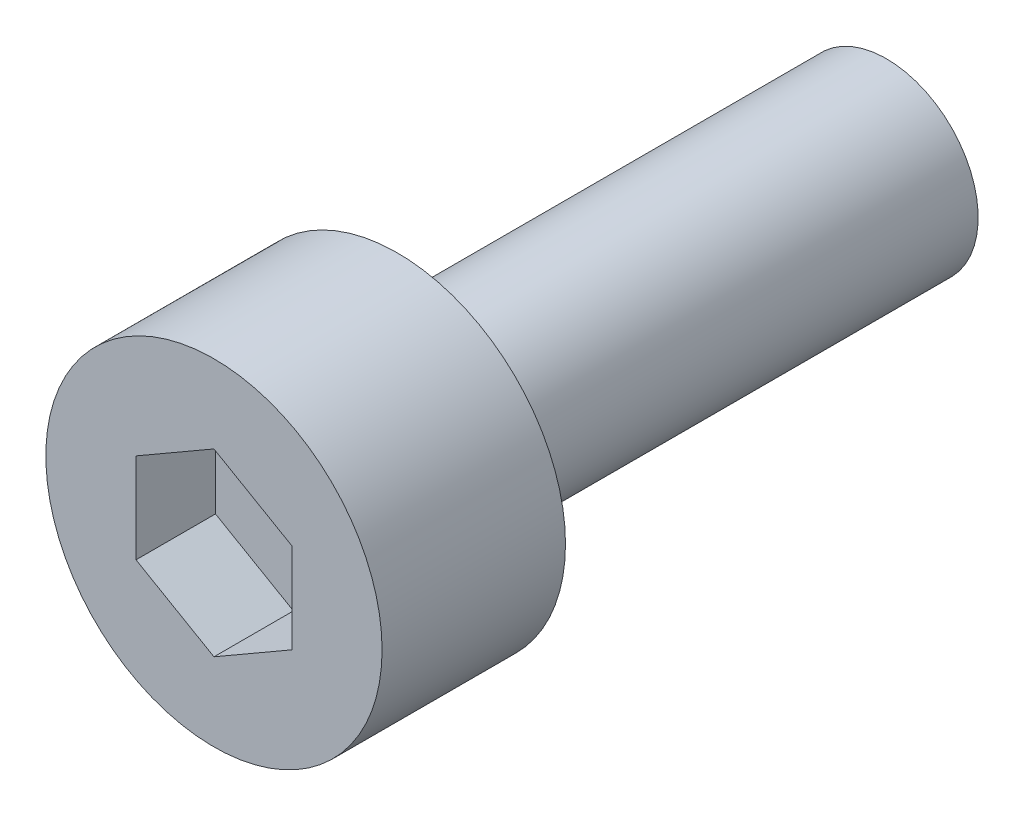
ISO-10303-21;
HEADER;
FILE_DESCRIPTION(('STEP AP214'),'2;1');
FILE_NAME('part.step','',(''),(''),'','','');
FILE_SCHEMA(('AUTOMOTIVE_DESIGN { 1 0 10303 214 1 1 1 1 }'));
ENDSEC;
DATA;
#1=APPLICATION_CONTEXT('core data for automotive mechanical design processes');
#2=APPLICATION_PROTOCOL_DEFINITION('international standard','automotive_design',2000,#1);
#3=PRODUCT_CONTEXT('',#1,'mechanical');
#4=PRODUCT('Part','Part','',(#3));
#5=PRODUCT_RELATED_PRODUCT_CATEGORY('part','',(#4));
#6=PRODUCT_DEFINITION_FORMATION('','',#4);
#7=PRODUCT_DEFINITION_CONTEXT('part definition',#1,'design');
#8=PRODUCT_DEFINITION('design','',#6,#7);
#9=PRODUCT_DEFINITION_SHAPE('','',#8);
#10=(LENGTH_UNIT() NAMED_UNIT(*) SI_UNIT(.MILLI.,.METRE.));
#11=(NAMED_UNIT(*) PLANE_ANGLE_UNIT() SI_UNIT($,.RADIAN.));
#12=(NAMED_UNIT(*) SI_UNIT($,.STERADIAN.) SOLID_ANGLE_UNIT());
#13=UNCERTAINTY_MEASURE_WITH_UNIT(LENGTH_MEASURE(1.E-05),#10,'distance_accuracy_value','');
#14=(GEOMETRIC_REPRESENTATION_CONTEXT(3) GLOBAL_UNCERTAINTY_ASSIGNED_CONTEXT((#13)) GLOBAL_UNIT_ASSIGNED_CONTEXT((#10,
#11,#12)) REPRESENTATION_CONTEXT('',''));
#15=CARTESIAN_POINT('',(0.,0.,0.));
#16=DIRECTION('',(0.,0.,1.));
#17=DIRECTION('',(1.,0.,0.));
#18=AXIS2_PLACEMENT_3D('',#15,#16,#17);
#19=CARTESIAN_POINT('',(0.,0.,3.));
#20=DIRECTION('',(0.,0.,-1.));
#21=DIRECTION('',(-1.,0.,0.));
#22=AXIS2_PLACEMENT_3D('',#19,#20,#21);
#23=CYLINDRICAL_SURFACE('',#22,2.75);
#24=CARTESIAN_POINT('',(0.,0.,3.));
#25=DIRECTION('',(0.,0.,1.));
#26=DIRECTION('',(1.,0.,0.));
#27=AXIS2_PLACEMENT_3D('',#24,#25,#26);
#28=CIRCLE('',#27,2.75);
#29=CARTESIAN_POINT('',(2.75,0.,3.));
#30=VERTEX_POINT('',#29);
#31=EDGE_CURVE('E48',#30,#30,#28,.T.);
#32=ORIENTED_EDGE('',*,*,#31,.F.);
#33=EDGE_LOOP('',(#32));
#34=FACE_BOUND('',#33,.T.);
#35=CARTESIAN_POINT('',(0.,0.,0.));
#36=DIRECTION('',(0.,0.,1.));
#37=DIRECTION('',(1.,0.,0.));
#38=AXIS2_PLACEMENT_3D('',#35,#36,#37);
#39=CIRCLE('',#38,2.75);
#40=CARTESIAN_POINT('',(2.75,0.,0.));
#41=VERTEX_POINT('',#40);
#42=EDGE_CURVE('E43',#41,#41,#39,.T.);
#43=ORIENTED_EDGE('',*,*,#42,.T.);
#44=EDGE_LOOP('',(#43));
#45=FACE_BOUND('',#44,.T.);
#46=ADVANCED_FACE('F40',(#34,#45),#23,.T.);
#47=CARTESIAN_POINT('',(0.,0.,3.));
#48=DIRECTION('',(0.,0.,1.));
#49=DIRECTION('',(1.,0.,0.));
#50=AXIS2_PLACEMENT_3D('',#47,#48,#49);
#51=PLANE('',#50);
#52=DIRECTION('',(0.866025403784439,0.5,0.));
#53=VECTOR('',#52,1.);
#54=CARTESIAN_POINT('',(0.,-1.47224318643355,3.));
#55=LINE('',#54,#53);
#56=CARTESIAN_POINT('',(0.,-1.47224318643355,3.));
#57=VERTEX_POINT('',#56);
#58=CARTESIAN_POINT('',(1.275,-0.736121593216773,3.));
#59=VERTEX_POINT('',#58);
#60=EDGE_CURVE('E56',#57,#59,#55,.T.);
#61=ORIENTED_EDGE('',*,*,#60,.F.);
#62=DIRECTION('',(0.866025403784439,-0.5,0.));
#63=VECTOR('',#62,1.);
#64=CARTESIAN_POINT('',(-1.275,-0.736121593216773,3.));
#65=LINE('',#64,#63);
#66=CARTESIAN_POINT('',(-1.275,-0.736121593216773,3.));
#67=VERTEX_POINT('',#66);
#68=EDGE_CURVE('E140',#67,#57,#65,.T.);
#69=ORIENTED_EDGE('',*,*,#68,.F.);
#70=DIRECTION('',(0.,-1.,0.));
#71=VECTOR('',#70,1.);
#72=CARTESIAN_POINT('',(-1.275,0.736121593216774,3.));
#73=LINE('',#72,#71);
#74=CARTESIAN_POINT('',(-1.275,0.736121593216774,3.));
#75=VERTEX_POINT('',#74);
#76=EDGE_CURVE('E138',#75,#67,#73,.T.);
#77=ORIENTED_EDGE('',*,*,#76,.F.);
#78=DIRECTION('',(-0.866025403784439,-0.5,0.));
#79=VECTOR('',#78,1.);
#80=CARTESIAN_POINT('',(0.,1.47224318643355,3.));
#81=LINE('',#80,#79);
#82=CARTESIAN_POINT('',(0.,1.47224318643355,3.));
#83=VERTEX_POINT('',#82);
#84=EDGE_CURVE('E104',#83,#75,#81,.T.);
#85=ORIENTED_EDGE('',*,*,#84,.F.);
#86=DIRECTION('',(-0.866025403784439,0.5,0.));
#87=VECTOR('',#86,1.);
#88=CARTESIAN_POINT('',(1.275,0.736121593216773,3.));
#89=LINE('',#88,#87);
#90=CARTESIAN_POINT('',(1.275,0.736121593216773,3.));
#91=VERTEX_POINT('',#90);
#92=EDGE_CURVE('E134',#91,#83,#89,.T.);
#93=ORIENTED_EDGE('',*,*,#92,.F.);
#94=DIRECTION('',(0.,1.,0.));
#95=VECTOR('',#94,1.);
#96=CARTESIAN_POINT('',(1.275,-0.736121593216773,3.));
#97=LINE('',#96,#95);
#98=EDGE_CURVE('E130',#59,#91,#97,.T.);
#99=ORIENTED_EDGE('',*,*,#98,.F.);
#100=EDGE_LOOP('',(#61,#69,#77,#85,#93,#99));
#101=FACE_BOUND('',#100,.T.);
#102=ORIENTED_EDGE('',*,*,#31,.T.);
#103=EDGE_LOOP('',(#102));
#104=FACE_BOUND('',#103,.T.);
#105=ADVANCED_FACE('F158',(#101,#104),#51,.T.);
#106=CARTESIAN_POINT('',(0.,0.,0.));
#107=DIRECTION('',(0.,0.,1.));
#108=DIRECTION('',(1.,0.,0.));
#109=AXIS2_PLACEMENT_3D('',#106,#107,#108);
#110=PLANE('',#109);
#111=CARTESIAN_POINT('',(0.,0.,0.));
#112=DIRECTION('',(0.,0.,-1.));
#113=DIRECTION('',(-1.,0.,0.));
#114=AXIS2_PLACEMENT_3D('',#111,#112,#113);
#115=CIRCLE('',#114,1.5);
#116=CARTESIAN_POINT('',(-1.5,0.,0.));
#117=VERTEX_POINT('',#116);
#118=EDGE_CURVE('E11',#117,#117,#115,.T.);
#119=ORIENTED_EDGE('',*,*,#118,.F.);
#120=EDGE_LOOP('',(#119));
#121=FACE_BOUND('',#120,.T.);
#122=ORIENTED_EDGE('',*,*,#42,.F.);
#123=EDGE_LOOP('',(#122));
#124=FACE_BOUND('',#123,.T.);
#125=ADVANCED_FACE('F155',(#121,#124),#110,.F.);
#126=CARTESIAN_POINT('',(0.,-1.47224318643355,1.7));
#127=DIRECTION('',(0.5,-0.866025403784439,0.));
#128=DIRECTION('',(0.866025403784439,0.5,0.));
#129=AXIS2_PLACEMENT_3D('',#126,#127,#128);
#130=PLANE('',#129);
#131=ORIENTED_EDGE('',*,*,#60,.T.);
#132=DIRECTION('',(0.,0.,1.));
#133=VECTOR('',#132,1.);
#134=CARTESIAN_POINT('',(1.275,-0.736121593216773,1.7));
#135=LINE('',#134,#133);
#136=CARTESIAN_POINT('',(1.275,-0.736121593216773,1.7));
#137=VERTEX_POINT('',#136);
#138=EDGE_CURVE('E86',#137,#59,#135,.T.);
#139=ORIENTED_EDGE('',*,*,#138,.F.);
#140=DIRECTION('',(0.866025403784439,0.5,0.));
#141=VECTOR('',#140,1.);
#142=CARTESIAN_POINT('',(0.,-1.47224318643355,1.7));
#143=LINE('',#142,#141);
#144=CARTESIAN_POINT('',(0.,-1.47224318643355,1.7));
#145=VERTEX_POINT('',#144);
#146=EDGE_CURVE('E142',#145,#137,#143,.T.);
#147=ORIENTED_EDGE('',*,*,#146,.F.);
#148=DIRECTION('',(0.,0.,1.));
#149=VECTOR('',#148,1.);
#150=CARTESIAN_POINT('',(0.,-1.47224318643355,1.7));
#151=LINE('',#150,#149);
#152=EDGE_CURVE('E64',#145,#57,#151,.T.);
#153=ORIENTED_EDGE('',*,*,#152,.T.);
#154=EDGE_LOOP('',(#131,#139,#147,#153));
#155=FACE_BOUND('',#154,.T.);
#156=ADVANCED_FACE('F157',(#155),#130,.F.);
#157=CARTESIAN_POINT('',(-1.275,-0.736121593216773,1.7));
#158=DIRECTION('',(-0.5,-0.866025403784439,0.));
#159=DIRECTION('',(0.866025403784439,-0.5,0.));
#160=AXIS2_PLACEMENT_3D('',#157,#158,#159);
#161=PLANE('',#160);
#162=ORIENTED_EDGE('',*,*,#68,.T.);
#163=ORIENTED_EDGE('',*,*,#152,.F.);
#164=DIRECTION('',(0.866025403784439,-0.5,0.));
#165=VECTOR('',#164,1.);
#166=CARTESIAN_POINT('',(-1.275,-0.736121593216773,1.7));
#167=LINE('',#166,#165);
#168=CARTESIAN_POINT('',(-1.275,-0.736121593216773,1.7));
#169=VERTEX_POINT('',#168);
#170=EDGE_CURVE('E116',#169,#145,#167,.T.);
#171=ORIENTED_EDGE('',*,*,#170,.F.);
#172=DIRECTION('',(0.,0.,1.));
#173=VECTOR('',#172,1.);
#174=CARTESIAN_POINT('',(-1.275,-0.736121593216773,1.7));
#175=LINE('',#174,#173);
#176=EDGE_CURVE('E108',#169,#67,#175,.T.);
#177=ORIENTED_EDGE('',*,*,#176,.T.);
#178=EDGE_LOOP('',(#162,#163,#171,#177));
#179=FACE_BOUND('',#178,.T.);
#180=ADVANCED_FACE('F164',(#179),#161,.F.);
#181=CARTESIAN_POINT('',(-1.275,0.736121593216774,1.7));
#182=DIRECTION('',(-1.,0.,0.));
#183=DIRECTION('',(0.,0.,1.));
#184=AXIS2_PLACEMENT_3D('',#181,#182,#183);
#185=PLANE('',#184);
#186=ORIENTED_EDGE('',*,*,#76,.T.);
#187=ORIENTED_EDGE('',*,*,#176,.F.);
#188=DIRECTION('',(0.,-1.,0.));
#189=VECTOR('',#188,1.);
#190=CARTESIAN_POINT('',(-1.275,0.736121593216774,1.7));
#191=LINE('',#190,#189);
#192=CARTESIAN_POINT('',(-1.275,0.736121593216774,1.7));
#193=VERTEX_POINT('',#192);
#194=EDGE_CURVE('E112',#193,#169,#191,.T.);
#195=ORIENTED_EDGE('',*,*,#194,.F.);
#196=DIRECTION('',(0.,0.,1.));
#197=VECTOR('',#196,1.);
#198=CARTESIAN_POINT('',(-1.275,0.736121593216774,1.7));
#199=LINE('',#198,#197);
#200=EDGE_CURVE('E97',#193,#75,#199,.T.);
#201=ORIENTED_EDGE('',*,*,#200,.T.);
#202=EDGE_LOOP('',(#186,#187,#195,#201));
#203=FACE_BOUND('',#202,.T.);
#204=ADVANCED_FACE('F113',(#203),#185,.F.);
#205=CARTESIAN_POINT('',(0.,1.47224318643355,1.7));
#206=DIRECTION('',(-0.5,0.866025403784439,0.));
#207=DIRECTION('',(-0.866025403784439,-0.5,0.));
#208=AXIS2_PLACEMENT_3D('',#205,#206,#207);
#209=PLANE('',#208);
#210=ORIENTED_EDGE('',*,*,#84,.T.);
#211=ORIENTED_EDGE('',*,*,#200,.F.);
#212=DIRECTION('',(-0.866025403784439,-0.5,0.));
#213=VECTOR('',#212,1.);
#214=CARTESIAN_POINT('',(0.,1.47224318643355,1.7));
#215=LINE('',#214,#213);
#216=CARTESIAN_POINT('',(0.,1.47224318643355,1.7));
#217=VERTEX_POINT('',#216);
#218=EDGE_CURVE('E101',#217,#193,#215,.T.);
#219=ORIENTED_EDGE('',*,*,#218,.F.);
#220=DIRECTION('',(0.,0.,1.));
#221=VECTOR('',#220,1.);
#222=CARTESIAN_POINT('',(0.,1.47224318643355,1.7));
#223=LINE('',#222,#221);
#224=EDGE_CURVE('E109',#217,#83,#223,.T.);
#225=ORIENTED_EDGE('',*,*,#224,.T.);
#226=EDGE_LOOP('',(#210,#211,#219,#225));
#227=FACE_BOUND('',#226,.T.);
#228=ADVANCED_FACE('F99',(#227),#209,.F.);
#229=CARTESIAN_POINT('',(1.275,0.736121593216773,1.7));
#230=DIRECTION('',(0.5,0.866025403784439,0.));
#231=DIRECTION('',(-0.866025403784439,0.5,0.));
#232=AXIS2_PLACEMENT_3D('',#229,#230,#231);
#233=PLANE('',#232);
#234=ORIENTED_EDGE('',*,*,#92,.T.);
#235=ORIENTED_EDGE('',*,*,#224,.F.);
#236=DIRECTION('',(-0.866025403784439,0.5,0.));
#237=VECTOR('',#236,1.);
#238=CARTESIAN_POINT('',(1.275,0.736121593216773,1.7));
#239=LINE('',#238,#237);
#240=CARTESIAN_POINT('',(1.275,0.736121593216773,1.7));
#241=VERTEX_POINT('',#240);
#242=EDGE_CURVE('E122',#241,#217,#239,.T.);
#243=ORIENTED_EDGE('',*,*,#242,.F.);
#244=DIRECTION('',(0.,0.,1.));
#245=VECTOR('',#244,1.);
#246=CARTESIAN_POINT('',(1.275,0.736121593216773,1.7));
#247=LINE('',#246,#245);
#248=EDGE_CURVE('E146',#241,#91,#247,.T.);
#249=ORIENTED_EDGE('',*,*,#248,.T.);
#250=EDGE_LOOP('',(#234,#235,#243,#249));
#251=FACE_BOUND('',#250,.T.);
#252=ADVANCED_FACE('F209',(#251),#233,.F.);
#253=CARTESIAN_POINT('',(1.275,-0.736121593216773,1.7));
#254=DIRECTION('',(1.,0.,0.));
#255=DIRECTION('',(0.,0.,-1.));
#256=AXIS2_PLACEMENT_3D('',#253,#254,#255);
#257=PLANE('',#256);
#258=ORIENTED_EDGE('',*,*,#98,.T.);
#259=ORIENTED_EDGE('',*,*,#248,.F.);
#260=DIRECTION('',(0.,1.,0.));
#261=VECTOR('',#260,1.);
#262=CARTESIAN_POINT('',(1.275,-0.736121593216773,1.7));
#263=LINE('',#262,#261);
#264=EDGE_CURVE('E124',#137,#241,#263,.T.);
#265=ORIENTED_EDGE('',*,*,#264,.F.);
#266=ORIENTED_EDGE('',*,*,#138,.T.);
#267=EDGE_LOOP('',(#258,#259,#265,#266));
#268=FACE_BOUND('',#267,.T.);
#269=ADVANCED_FACE('F218',(#268),#257,.F.);
#270=CARTESIAN_POINT('',(0.,0.,1.7));
#271=DIRECTION('',(0.,0.,1.));
#272=DIRECTION('',(1.,0.,0.));
#273=AXIS2_PLACEMENT_3D('',#270,#271,#272);
#274=PLANE('',#273);
#275=ORIENTED_EDGE('',*,*,#146,.T.);
#276=ORIENTED_EDGE('',*,*,#264,.T.);
#277=ORIENTED_EDGE('',*,*,#242,.T.);
#278=ORIENTED_EDGE('',*,*,#218,.T.);
#279=ORIENTED_EDGE('',*,*,#194,.T.);
#280=ORIENTED_EDGE('',*,*,#170,.T.);
#281=EDGE_LOOP('',(#275,#276,#277,#278,#279,#280));
#282=FACE_BOUND('',#281,.T.);
#283=ADVANCED_FACE('F119',(#282),#274,.T.);
#284=CARTESIAN_POINT('',(0.,0.,-8.));
#285=DIRECTION('',(0.,0.,1.));
#286=DIRECTION('',(1.,0.,0.));
#287=AXIS2_PLACEMENT_3D('',#284,#285,#286);
#288=CYLINDRICAL_SURFACE('',#287,1.5);
#289=CARTESIAN_POINT('',(0.,0.,-8.));
#290=DIRECTION('',(0.,0.,-1.));
#291=DIRECTION('',(-1.,0.,0.));
#292=AXIS2_PLACEMENT_3D('',#289,#290,#291);
#293=CIRCLE('',#292,1.5);
#294=CARTESIAN_POINT('',(-1.5,0.,-8.));
#295=VERTEX_POINT('',#294);
#296=EDGE_CURVE('E131',#295,#295,#293,.T.);
#297=ORIENTED_EDGE('',*,*,#296,.F.);
#298=EDGE_LOOP('',(#297));
#299=FACE_BOUND('',#298,.T.);
#300=ORIENTED_EDGE('',*,*,#118,.T.);
#301=EDGE_LOOP('',(#300));
#302=FACE_BOUND('',#301,.T.);
#303=ADVANCED_FACE('F236',(#299,#302),#288,.T.);
#304=CARTESIAN_POINT('',(0.,0.,-8.));
#305=DIRECTION('',(0.,0.,-1.));
#306=DIRECTION('',(-1.,0.,0.));
#307=AXIS2_PLACEMENT_3D('',#304,#305,#306);
#308=PLANE('',#307);
#309=ORIENTED_EDGE('',*,*,#296,.T.);
#310=EDGE_LOOP('',(#309));
#311=FACE_BOUND('',#310,.T.);
#312=ADVANCED_FACE('F250',(#311),#308,.T.);
#313=CLOSED_SHELL('',(#46,#105,#125,#156,#180,#204,#228,#252,#269,#283,#303,#312));
#314=MANIFOLD_SOLID_BREP('B2',#313);
#315=ADVANCED_BREP_SHAPE_REPRESENTATION('',(#18,#314),#14);
#316=SHAPE_DEFINITION_REPRESENTATION(#9,#315);
ENDSEC;
END-ISO-10303-21;
